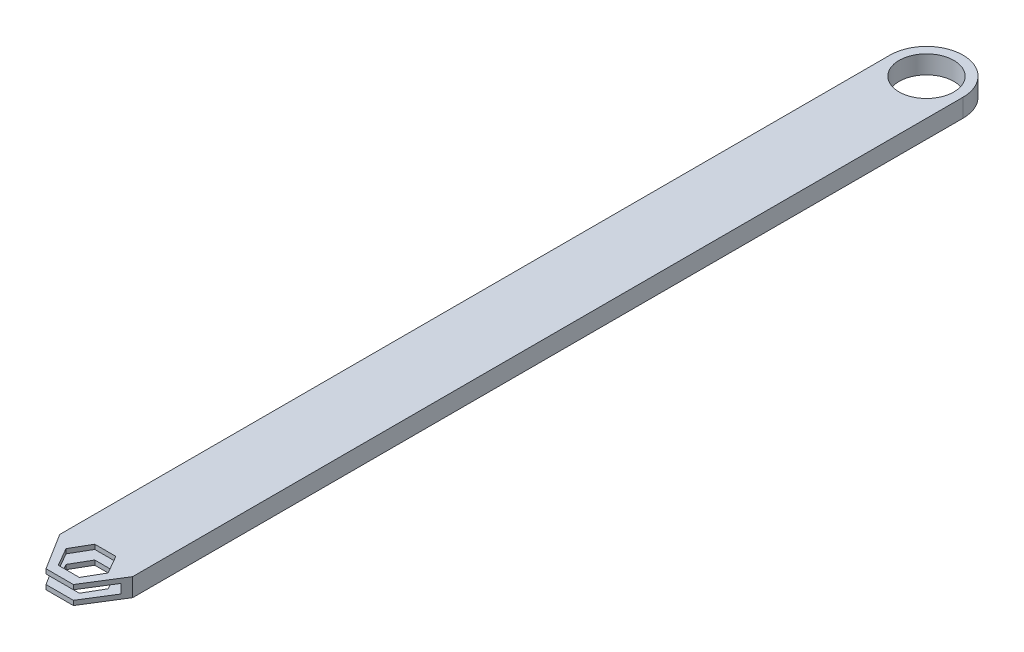
ISO-10303-21;
HEADER;
FILE_DESCRIPTION(('STEP AP214'),'2;1');
FILE_NAME('part.step','',(''),(''),'','','');
FILE_SCHEMA(('AUTOMOTIVE_DESIGN { 1 0 10303 214 1 1 1 1 }'));
ENDSEC;
DATA;
#1=APPLICATION_CONTEXT('core data for automotive mechanical design processes');
#2=APPLICATION_PROTOCOL_DEFINITION('international standard','automotive_design',2000,#1);
#3=PRODUCT_CONTEXT('',#1,'mechanical');
#4=PRODUCT('Part','Part','',(#3));
#5=PRODUCT_RELATED_PRODUCT_CATEGORY('part','',(#4));
#6=PRODUCT_DEFINITION_FORMATION('','',#4);
#7=PRODUCT_DEFINITION_CONTEXT('part definition',#1,'design');
#8=PRODUCT_DEFINITION('design','',#6,#7);
#9=PRODUCT_DEFINITION_SHAPE('','',#8);
#10=(LENGTH_UNIT() NAMED_UNIT(*) SI_UNIT(.MILLI.,.METRE.));
#11=(NAMED_UNIT(*) PLANE_ANGLE_UNIT() SI_UNIT($,.RADIAN.));
#12=(NAMED_UNIT(*) SI_UNIT($,.STERADIAN.) SOLID_ANGLE_UNIT());
#13=UNCERTAINTY_MEASURE_WITH_UNIT(LENGTH_MEASURE(1.E-05),#10,'distance_accuracy_value','');
#14=(GEOMETRIC_REPRESENTATION_CONTEXT(3) GLOBAL_UNCERTAINTY_ASSIGNED_CONTEXT((#13)) GLOBAL_UNIT_ASSIGNED_CONTEXT((#10,
#11,#12)) REPRESENTATION_CONTEXT('',''));
#15=CARTESIAN_POINT('',(0.,0.,0.));
#16=DIRECTION('',(0.,0.,1.));
#17=DIRECTION('',(1.,0.,0.));
#18=AXIS2_PLACEMENT_3D('',#15,#16,#17);
#19=CARTESIAN_POINT('',(0.,0.,304.8));
#20=DIRECTION('',(1.,0.,0.));
#21=DIRECTION('',(0.,0.,-1.));
#22=AXIS2_PLACEMENT_3D('',#19,#20,#21);
#23=PLANE('',#22);
#24=DIRECTION('',(0.,0.,-1.));
#25=VECTOR('',#24,1.);
#26=CARTESIAN_POINT('',(0.,0.,304.8));
#27=LINE('',#26,#25);
#28=CARTESIAN_POINT('',(0.,0.,288.925));
#29=VERTEX_POINT('',#28);
#30=CARTESIAN_POINT('',(0.,0.,0.));
#31=VERTEX_POINT('',#30);
#32=EDGE_CURVE('E213',#29,#31,#27,.T.);
#33=ORIENTED_EDGE('',*,*,#32,.F.);
#34=DIRECTION('',(0.,1.,0.));
#35=VECTOR('',#34,1.);
#36=CARTESIAN_POINT('',(0.,0.,288.925));
#37=LINE('',#36,#35);
#38=CARTESIAN_POINT('',(0.,6.35,288.925));
#39=VERTEX_POINT('',#38);
#40=EDGE_CURVE('E267',#29,#39,#37,.T.);
#41=ORIENTED_EDGE('',*,*,#40,.T.);
#42=DIRECTION('',(0.,0.,-1.));
#43=VECTOR('',#42,1.);
#44=CARTESIAN_POINT('',(0.,6.35,304.8));
#45=LINE('',#44,#43);
#46=CARTESIAN_POINT('',(0.,6.35,0.));
#47=VERTEX_POINT('',#46);
#48=EDGE_CURVE('E203',#39,#47,#45,.T.);
#49=ORIENTED_EDGE('',*,*,#48,.T.);
#50=DIRECTION('',(0.,-1.,0.));
#51=VECTOR('',#50,1.);
#52=CARTESIAN_POINT('',(0.,0.,0.));
#53=LINE('',#52,#51);
#54=EDGE_CURVE('E204',#47,#31,#53,.T.);
#55=ORIENTED_EDGE('',*,*,#54,.T.);
#56=EDGE_LOOP('',(#33,#41,#49,#55));
#57=FACE_BOUND('',#56,.T.);
#58=ADVANCED_FACE('F33',(#57),#23,.F.);
#59=CARTESIAN_POINT('',(0.,0.,304.8));
#60=DIRECTION('',(0.,1.,0.));
#61=DIRECTION('',(0.,0.,1.));
#62=AXIS2_PLACEMENT_3D('',#59,#60,#61);
#63=PLANE('',#62);
#64=CARTESIAN_POINT('',(12.7,0.,0.));
#65=DIRECTION('',(0.,1.,0.));
#66=DIRECTION('',(0.,0.,1.));
#67=AXIS2_PLACEMENT_3D('',#64,#65,#66);
#68=CIRCLE('',#67,9.525);
#69=CARTESIAN_POINT('',(12.7,0.,9.525));
#70=VERTEX_POINT('',#69);
#71=EDGE_CURVE('E382',#70,#70,#68,.T.);
#72=ORIENTED_EDGE('',*,*,#71,.T.);
#73=EDGE_LOOP('',(#72));
#74=FACE_BOUND('',#73,.T.);
#75=DIRECTION('',(-0.500000000000002,0.,0.866025403784438));
#76=VECTOR('',#75,1.);
#77=CARTESIAN_POINT('',(20.0323484187083,0.,292.1));
#78=LINE('',#77,#76);
#79=CARTESIAN_POINT('',(20.0323484187083,0.,292.1));
#80=VERTEX_POINT('',#79);
#81=CARTESIAN_POINT('',(16.3661742093542,0.,298.45));
#82=VERTEX_POINT('',#81);
#83=EDGE_CURVE('E312',#80,#82,#78,.T.);
#84=ORIENTED_EDGE('',*,*,#83,.F.);
#85=DIRECTION('',(0.499999999999998,0.,0.866025403784439));
#86=VECTOR('',#85,1.);
#87=CARTESIAN_POINT('',(16.3661742093543,0.,285.75));
#88=LINE('',#87,#86);
#89=CARTESIAN_POINT('',(16.3661742093543,0.,285.75));
#90=VERTEX_POINT('',#89);
#91=EDGE_CURVE('E290',#90,#80,#88,.T.);
#92=ORIENTED_EDGE('',*,*,#91,.F.);
#93=DIRECTION('',(1.,0.,0.));
#94=VECTOR('',#93,1.);
#95=CARTESIAN_POINT('',(9.03382579064585,0.,285.75));
#96=LINE('',#95,#94);
#97=CARTESIAN_POINT('',(9.03382579064585,0.,285.75));
#98=VERTEX_POINT('',#97);
#99=EDGE_CURVE('E295',#98,#90,#96,.T.);
#100=ORIENTED_EDGE('',*,*,#99,.F.);
#101=DIRECTION('',(0.499999999999999,0.,-0.866025403784439));
#102=VECTOR('',#101,1.);
#103=CARTESIAN_POINT('',(5.36765158129173,0.,292.1));
#104=LINE('',#103,#102);
#105=CARTESIAN_POINT('',(5.36765158129173,0.,292.1));
#106=VERTEX_POINT('',#105);
#107=EDGE_CURVE('E321',#106,#98,#104,.T.);
#108=ORIENTED_EDGE('',*,*,#107,.F.);
#109=DIRECTION('',(-0.500000000000001,0.,-0.866025403784438));
#110=VECTOR('',#109,1.);
#111=CARTESIAN_POINT('',(9.03382579064587,0.,298.45));
#112=LINE('',#111,#110);
#113=CARTESIAN_POINT('',(9.03382579064587,0.,298.45));
#114=VERTEX_POINT('',#113);
#115=EDGE_CURVE('E318',#114,#106,#112,.T.);
#116=ORIENTED_EDGE('',*,*,#115,.F.);
#117=DIRECTION('',(-1.,0.,0.));
#118=VECTOR('',#117,1.);
#119=CARTESIAN_POINT('',(16.3661742093542,0.,298.45));
#120=LINE('',#119,#118);
#121=EDGE_CURVE('E315',#82,#114,#120,.T.);
#122=ORIENTED_EDGE('',*,*,#121,.F.);
#123=EDGE_LOOP('',(#84,#92,#100,#108,#116,#122));
#124=FACE_BOUND('',#123,.T.);
#125=ORIENTED_EDGE('',*,*,#32,.T.);
#126=CARTESIAN_POINT('',(12.7,0.,0.));
#127=DIRECTION('',(0.,1.,0.));
#128=DIRECTION('',(0.,0.,1.));
#129=AXIS2_PLACEMENT_3D('',#126,#127,#128);
#130=CIRCLE('',#129,12.7);
#131=CARTESIAN_POINT('',(25.4,0.,0.));
#132=VERTEX_POINT('',#131);
#133=EDGE_CURVE('E196',#132,#31,#130,.T.);
#134=ORIENTED_EDGE('',*,*,#133,.F.);
#135=DIRECTION('',(0.,0.,-1.));
#136=VECTOR('',#135,1.);
#137=CARTESIAN_POINT('',(25.4,0.,304.8));
#138=LINE('',#137,#136);
#139=CARTESIAN_POINT('',(25.4,0.,288.925));
#140=VERTEX_POINT('',#139);
#141=EDGE_CURVE('E210',#140,#132,#138,.T.);
#142=ORIENTED_EDGE('',*,*,#141,.F.);
#143=DIRECTION('',(-0.529998940003178,0.,0.847998304005089));
#144=VECTOR('',#143,1.);
#145=CARTESIAN_POINT('',(17.4625,0.,301.625));
#146=LINE('',#145,#144);
#147=CARTESIAN_POINT('',(17.4625,0.,301.625));
#148=VERTEX_POINT('',#147);
#149=EDGE_CURVE('E396',#140,#148,#146,.T.);
#150=ORIENTED_EDGE('',*,*,#149,.T.);
#151=DIRECTION('',(-1.,0.,0.));
#152=VECTOR('',#151,1.);
#153=CARTESIAN_POINT('',(7.93750000000002,0.,301.625));
#154=LINE('',#153,#152);
#155=CARTESIAN_POINT('',(7.93750000000002,0.,301.625));
#156=VERTEX_POINT('',#155);
#157=EDGE_CURVE('E398',#148,#156,#154,.T.);
#158=ORIENTED_EDGE('',*,*,#157,.T.);
#159=DIRECTION('',(-0.52999894000318,0.,-0.847998304005088));
#160=VECTOR('',#159,1.);
#161=CARTESIAN_POINT('',(0.,0.,288.925));
#162=LINE('',#161,#160);
#163=EDGE_CURVE('E265',#156,#29,#162,.T.);
#164=ORIENTED_EDGE('',*,*,#163,.T.);
#165=EDGE_LOOP('',(#125,#134,#142,#150,#158,#164));
#166=FACE_BOUND('',#165,.T.);
#167=ADVANCED_FACE('F208',(#74,#124,#166),#63,.F.);
#168=CARTESIAN_POINT('',(25.4,0.,304.8));
#169=DIRECTION('',(-1.,0.,0.));
#170=DIRECTION('',(0.,0.,1.));
#171=AXIS2_PLACEMENT_3D('',#168,#169,#170);
#172=PLANE('',#171);
#173=DIRECTION('',(0.,0.,-1.));
#174=VECTOR('',#173,1.);
#175=CARTESIAN_POINT('',(25.4,6.35,304.8));
#176=LINE('',#175,#174);
#177=CARTESIAN_POINT('',(25.4,6.35,288.925));
#178=VERTEX_POINT('',#177);
#179=CARTESIAN_POINT('',(25.4,6.35,0.));
#180=VERTEX_POINT('',#179);
#181=EDGE_CURVE('E218',#178,#180,#176,.T.);
#182=ORIENTED_EDGE('',*,*,#181,.F.);
#183=DIRECTION('',(0.,1.,0.));
#184=VECTOR('',#183,1.);
#185=CARTESIAN_POINT('',(25.4,0.,288.925));
#186=LINE('',#185,#184);
#187=EDGE_CURVE('E54',#140,#178,#186,.T.);
#188=ORIENTED_EDGE('',*,*,#187,.F.);
#189=ORIENTED_EDGE('',*,*,#141,.T.);
#190=DIRECTION('',(0.,1.,0.));
#191=VECTOR('',#190,1.);
#192=CARTESIAN_POINT('',(25.4,0.,0.));
#193=LINE('',#192,#191);
#194=EDGE_CURVE('E192',#132,#180,#193,.T.);
#195=ORIENTED_EDGE('',*,*,#194,.T.);
#196=EDGE_LOOP('',(#182,#188,#189,#195));
#197=FACE_BOUND('',#196,.T.);
#198=ADVANCED_FACE('F217',(#197),#172,.F.);
#199=CARTESIAN_POINT('',(0.,6.35,304.8));
#200=DIRECTION('',(0.,-1.,0.));
#201=DIRECTION('',(0.,0.,-1.));
#202=AXIS2_PLACEMENT_3D('',#199,#200,#201);
#203=PLANE('',#202);
#204=CARTESIAN_POINT('',(12.7,6.35,0.));
#205=DIRECTION('',(0.,1.,0.));
#206=DIRECTION('',(0.,0.,1.));
#207=AXIS2_PLACEMENT_3D('',#204,#205,#206);
#208=CIRCLE('',#207,9.525);
#209=CARTESIAN_POINT('',(12.7,6.35,9.525));
#210=VERTEX_POINT('',#209);
#211=EDGE_CURVE('E385',#210,#210,#208,.T.);
#212=ORIENTED_EDGE('',*,*,#211,.F.);
#213=EDGE_LOOP('',(#212));
#214=FACE_BOUND('',#213,.T.);
#215=DIRECTION('',(1.,0.,0.));
#216=VECTOR('',#215,1.);
#217=CARTESIAN_POINT('',(9.03382579064585,6.35,285.75));
#218=LINE('',#217,#216);
#219=CARTESIAN_POINT('',(9.03382579064585,6.35,285.75));
#220=VERTEX_POINT('',#219);
#221=CARTESIAN_POINT('',(16.3661742093543,6.35,285.75));
#222=VERTEX_POINT('',#221);
#223=EDGE_CURVE('E307',#220,#222,#218,.T.);
#224=ORIENTED_EDGE('',*,*,#223,.T.);
#225=DIRECTION('',(0.499999999999998,0.,0.866025403784439));
#226=VECTOR('',#225,1.);
#227=CARTESIAN_POINT('',(16.3661742093543,6.35,285.75));
#228=LINE('',#227,#226);
#229=CARTESIAN_POINT('',(20.0323484187083,6.35,292.1));
#230=VERTEX_POINT('',#229);
#231=EDGE_CURVE('E291',#222,#230,#228,.T.);
#232=ORIENTED_EDGE('',*,*,#231,.T.);
#233=DIRECTION('',(-0.500000000000002,0.,0.866025403784438));
#234=VECTOR('',#233,1.);
#235=CARTESIAN_POINT('',(20.0323484187083,6.35,292.1));
#236=LINE('',#235,#234);
#237=CARTESIAN_POINT('',(16.3661742093542,6.35,298.45));
#238=VERTEX_POINT('',#237);
#239=EDGE_CURVE('E294',#230,#238,#236,.T.);
#240=ORIENTED_EDGE('',*,*,#239,.T.);
#241=DIRECTION('',(-1.,0.,0.));
#242=VECTOR('',#241,1.);
#243=CARTESIAN_POINT('',(16.3661742093542,6.35,298.45));
#244=LINE('',#243,#242);
#245=CARTESIAN_POINT('',(9.03382579064587,6.35,298.45));
#246=VERTEX_POINT('',#245);
#247=EDGE_CURVE('E298',#238,#246,#244,.T.);
#248=ORIENTED_EDGE('',*,*,#247,.T.);
#249=DIRECTION('',(-0.500000000000001,0.,-0.866025403784438));
#250=VECTOR('',#249,1.);
#251=CARTESIAN_POINT('',(9.03382579064587,6.35,298.45));
#252=LINE('',#251,#250);
#253=CARTESIAN_POINT('',(5.36765158129173,6.35,292.1));
#254=VERTEX_POINT('',#253);
#255=EDGE_CURVE('E301',#246,#254,#252,.T.);
#256=ORIENTED_EDGE('',*,*,#255,.T.);
#257=DIRECTION('',(0.499999999999999,0.,-0.866025403784439));
#258=VECTOR('',#257,1.);
#259=CARTESIAN_POINT('',(5.36765158129173,6.35,292.1));
#260=LINE('',#259,#258);
#261=EDGE_CURVE('E304',#254,#220,#260,.T.);
#262=ORIENTED_EDGE('',*,*,#261,.T.);
#263=EDGE_LOOP('',(#224,#232,#240,#248,#256,#262));
#264=FACE_BOUND('',#263,.T.);
#265=ORIENTED_EDGE('',*,*,#181,.T.);
#266=CARTESIAN_POINT('',(12.7,6.35,0.));
#267=DIRECTION('',(0.,1.,0.));
#268=DIRECTION('',(0.,0.,1.));
#269=AXIS2_PLACEMENT_3D('',#266,#267,#268);
#270=CIRCLE('',#269,12.7);
#271=EDGE_CURVE('E198',#180,#47,#270,.T.);
#272=ORIENTED_EDGE('',*,*,#271,.T.);
#273=ORIENTED_EDGE('',*,*,#48,.F.);
#274=DIRECTION('',(-0.52999894000318,0.,-0.847998304005088));
#275=VECTOR('',#274,1.);
#276=CARTESIAN_POINT('',(0.,6.35,288.925));
#277=LINE('',#276,#275);
#278=CARTESIAN_POINT('',(7.93750000000002,6.35,301.625));
#279=VERTEX_POINT('',#278);
#280=EDGE_CURVE('E381',#279,#39,#277,.T.);
#281=ORIENTED_EDGE('',*,*,#280,.F.);
#282=DIRECTION('',(-1.,0.,0.));
#283=VECTOR('',#282,1.);
#284=CARTESIAN_POINT('',(7.93750000000002,6.35,301.625));
#285=LINE('',#284,#283);
#286=CARTESIAN_POINT('',(17.4625,6.35,301.625));
#287=VERTEX_POINT('',#286);
#288=EDGE_CURVE('E402',#287,#279,#285,.T.);
#289=ORIENTED_EDGE('',*,*,#288,.F.);
#290=DIRECTION('',(-0.529998940003178,0.,0.847998304005089));
#291=VECTOR('',#290,1.);
#292=CARTESIAN_POINT('',(17.4625,6.35,301.625));
#293=LINE('',#292,#291);
#294=EDGE_CURVE('E395',#178,#287,#293,.T.);
#295=ORIENTED_EDGE('',*,*,#294,.F.);
#296=EDGE_LOOP('',(#265,#272,#273,#281,#289,#295));
#297=FACE_BOUND('',#296,.T.);
#298=ADVANCED_FACE('F379',(#214,#264,#297),#203,.F.);
#299=CARTESIAN_POINT('',(23.8125,4.7625,0.));
#300=DIRECTION('',(0.,1.,0.));
#301=DIRECTION('',(0.,0.,1.));
#302=AXIS2_PLACEMENT_3D('',#299,#300,#301);
#303=PLANE('',#302);
#304=DIRECTION('',(0.500000000000002,0.,-0.866025403784438));
#305=VECTOR('',#304,1.);
#306=CARTESIAN_POINT('',(147.460396536749,4.7625,71.3881463502232));
#307=LINE('',#306,#305);
#308=CARTESIAN_POINT('',(16.3661742093542,4.7625,298.45));
#309=VERTEX_POINT('',#308);
#310=CARTESIAN_POINT('',(20.0323484187083,4.7625,292.1));
#311=VERTEX_POINT('',#310);
#312=EDGE_CURVE('E329',#309,#311,#307,.T.);
#313=ORIENTED_EDGE('',*,*,#312,.T.);
#314=DIRECTION('',(-0.499999999999998,0.,-0.86602540378444));
#315=VECTOR('',#314,1.);
#316=CARTESIAN_POINT('',(-105.505623908686,4.7625,74.6618536497767));
#317=LINE('',#316,#315);
#318=CARTESIAN_POINT('',(16.3661742093543,4.7625,285.75));
#319=VERTEX_POINT('',#318);
#320=EDGE_CURVE('E363',#311,#319,#317,.T.);
#321=ORIENTED_EDGE('',*,*,#320,.T.);
#322=DIRECTION('',(-1.,0.,0.));
#323=VECTOR('',#322,1.);
#324=CARTESIAN_POINT('',(23.8125,4.7625,285.75));
#325=LINE('',#324,#323);
#326=CARTESIAN_POINT('',(9.03382579064585,4.7625,285.75));
#327=VERTEX_POINT('',#326);
#328=EDGE_CURVE('E360',#319,#327,#325,.T.);
#329=ORIENTED_EDGE('',*,*,#328,.T.);
#330=DIRECTION('',(-0.499999999999999,0.,0.866025403784439));
#331=VECTOR('',#330,1.);
#332=CARTESIAN_POINT('',(136.461873908686,4.7625,65.0381463502224));
#333=LINE('',#332,#331);
#334=CARTESIAN_POINT('',(5.36765158129173,4.7625,292.1));
#335=VERTEX_POINT('',#334);
#336=EDGE_CURVE('E357',#327,#335,#333,.T.);
#337=ORIENTED_EDGE('',*,*,#336,.T.);
#338=DIRECTION('',(0.500000000000001,0.,0.866025403784438));
#339=VECTOR('',#338,1.);
#340=CARTESIAN_POINT('',(-116.504146536749,4.7625,81.0118536497775));
#341=LINE('',#340,#339);
#342=CARTESIAN_POINT('',(9.03382579064587,4.7625,298.45));
#343=VERTEX_POINT('',#342);
#344=EDGE_CURVE('E354',#335,#343,#341,.T.);
#345=ORIENTED_EDGE('',*,*,#344,.T.);
#346=DIRECTION('',(1.,0.,0.));
#347=VECTOR('',#346,1.);
#348=CARTESIAN_POINT('',(23.8125,4.7625,298.45));
#349=LINE('',#348,#347);
#350=EDGE_CURVE('E351',#343,#309,#349,.T.);
#351=ORIENTED_EDGE('',*,*,#350,.T.);
#352=EDGE_LOOP('',(#313,#321,#329,#337,#345,#351));
#353=FACE_BOUND('',#352,.T.);
#354=DIRECTION('',(0.,0.,1.));
#355=VECTOR('',#354,1.);
#356=CARTESIAN_POINT('',(1.5875,4.7625,0.));
#357=LINE('',#356,#355);
#358=CARTESIAN_POINT('',(1.5875,4.7625,6.14836106210428));
#359=VERTEX_POINT('',#358);
#360=CARTESIAN_POINT('',(1.5875,4.7625,291.465));
#361=VERTEX_POINT('',#360);
#362=EDGE_CURVE('E366',#359,#361,#357,.T.);
#363=ORIENTED_EDGE('',*,*,#362,.F.);
#364=CARTESIAN_POINT('',(12.7,4.7625,0.));
#365=DIRECTION('',(0.,1.,0.));
#366=DIRECTION('',(0.,0.,1.));
#367=AXIS2_PLACEMENT_3D('',#364,#365,#366);
#368=CIRCLE('',#367,12.7);
#369=CARTESIAN_POINT('',(23.8125,4.7625,6.14836106210428));
#370=VERTEX_POINT('',#369);
#371=EDGE_CURVE('E47',#359,#370,#368,.T.);
#372=ORIENTED_EDGE('',*,*,#371,.T.);
#373=DIRECTION('',(0.,0.,1.));
#374=VECTOR('',#373,1.);
#375=CARTESIAN_POINT('',(23.8125,4.7625,0.));
#376=LINE('',#375,#374);
#377=CARTESIAN_POINT('',(23.8125,4.7625,291.465));
#378=VERTEX_POINT('',#377);
#379=EDGE_CURVE('E367',#370,#378,#376,.T.);
#380=ORIENTED_EDGE('',*,*,#379,.T.);
#381=DIRECTION('',(-0.529998940003178,0.,0.84799830400509));
#382=VECTOR('',#381,1.);
#383=CARTESIAN_POINT('',(154.808005617977,4.7625,81.8721910112352));
#384=LINE('',#383,#382);
#385=CARTESIAN_POINT('',(17.4625,4.7625,301.625));
#386=VERTEX_POINT('',#385);
#387=EDGE_CURVE('E284',#378,#386,#384,.T.);
#388=ORIENTED_EDGE('',*,*,#387,.T.);
#389=DIRECTION('',(-1.,0.,0.));
#390=VECTOR('',#389,1.);
#391=CARTESIAN_POINT('',(23.8125,4.7625,301.625));
#392=LINE('',#391,#390);
#393=CARTESIAN_POINT('',(7.93750000000002,4.7625,301.625));
#394=VERTEX_POINT('',#393);
#395=EDGE_CURVE('E287',#386,#394,#392,.T.);
#396=ORIENTED_EDGE('',*,*,#395,.T.);
#397=DIRECTION('',(-0.52999894000318,0.,-0.847998304005088));
#398=VECTOR('',#397,1.);
#399=CARTESIAN_POINT('',(-123.165028089888,4.7625,91.8609550561796));
#400=LINE('',#399,#398);
#401=EDGE_CURVE('E278',#394,#361,#400,.T.);
#402=ORIENTED_EDGE('',*,*,#401,.T.);
#403=EDGE_LOOP('',(#363,#372,#380,#388,#396,#402));
#404=FACE_BOUND('',#403,.T.);
#405=ADVANCED_FACE('F413',(#353,#404),#303,.F.);
#406=CARTESIAN_POINT('',(23.8125,1.5875,0.));
#407=DIRECTION('',(1.,0.,0.));
#408=DIRECTION('',(0.,0.,-1.));
#409=AXIS2_PLACEMENT_3D('',#406,#407,#408);
#410=PLANE('',#409);
#411=ORIENTED_EDGE('',*,*,#379,.F.);
#412=DIRECTION('',(0.,1.,0.));
#413=VECTOR('',#412,1.);
#414=CARTESIAN_POINT('',(23.8125,0.,6.14836106210428));
#415=LINE('',#414,#413);
#416=CARTESIAN_POINT('',(23.8125,1.5875,6.14836106210428));
#417=VERTEX_POINT('',#416);
#418=EDGE_CURVE('E391',#370,#417,#415,.F.);
#419=ORIENTED_EDGE('',*,*,#418,.T.);
#420=DIRECTION('',(0.,0.,1.));
#421=VECTOR('',#420,1.);
#422=CARTESIAN_POINT('',(23.8125,1.5875,0.));
#423=LINE('',#422,#421);
#424=CARTESIAN_POINT('',(23.8125,1.5875,291.465));
#425=VERTEX_POINT('',#424);
#426=EDGE_CURVE('E369',#417,#425,#423,.T.);
#427=ORIENTED_EDGE('',*,*,#426,.T.);
#428=DIRECTION('',(0.,1.,0.));
#429=VECTOR('',#428,1.);
#430=CARTESIAN_POINT('',(23.8125,1.5875,291.465));
#431=LINE('',#430,#429);
#432=EDGE_CURVE('E281',#425,#378,#431,.T.);
#433=ORIENTED_EDGE('',*,*,#432,.T.);
#434=EDGE_LOOP('',(#411,#419,#427,#433));
#435=FACE_BOUND('',#434,.T.);
#436=ADVANCED_FACE('F416',(#435),#410,.F.);
#437=CARTESIAN_POINT('',(1.5875,1.5875,0.));
#438=DIRECTION('',(0.,-1.,0.));
#439=DIRECTION('',(0.,0.,-1.));
#440=AXIS2_PLACEMENT_3D('',#437,#438,#439);
#441=PLANE('',#440);
#442=DIRECTION('',(1.,0.,0.));
#443=VECTOR('',#442,1.);
#444=CARTESIAN_POINT('',(1.5875,1.5875,285.75));
#445=LINE('',#444,#443);
#446=CARTESIAN_POINT('',(9.03382579064585,1.5875,285.75));
#447=VERTEX_POINT('',#446);
#448=CARTESIAN_POINT('',(16.3661742093543,1.5875,285.75));
#449=VERTEX_POINT('',#448);
#450=EDGE_CURVE('E236',#447,#449,#445,.T.);
#451=ORIENTED_EDGE('',*,*,#450,.T.);
#452=DIRECTION('',(0.499999999999998,0.,0.86602540378444));
#453=VECTOR('',#452,1.);
#454=CARTESIAN_POINT('',(-111.061873908686,1.5875,65.0381463502222));
#455=LINE('',#454,#453);
#456=CARTESIAN_POINT('',(20.0323484187083,1.5875,292.1));
#457=VERTEX_POINT('',#456);
#458=EDGE_CURVE('E239',#449,#457,#455,.T.);
#459=ORIENTED_EDGE('',*,*,#458,.T.);
#460=DIRECTION('',(-0.500000000000002,0.,0.866025403784438));
#461=VECTOR('',#460,1.);
#462=CARTESIAN_POINT('',(141.904146536749,1.5875,81.0118536497778));
#463=LINE('',#462,#461);
#464=CARTESIAN_POINT('',(16.3661742093542,1.5875,298.45));
#465=VERTEX_POINT('',#464);
#466=EDGE_CURVE('E220',#457,#465,#463,.T.);
#467=ORIENTED_EDGE('',*,*,#466,.T.);
#468=DIRECTION('',(-1.,0.,0.));
#469=VECTOR('',#468,1.);
#470=CARTESIAN_POINT('',(1.5875,1.5875,298.45));
#471=LINE('',#470,#469);
#472=CARTESIAN_POINT('',(9.03382579064587,1.5875,298.45));
#473=VERTEX_POINT('',#472);
#474=EDGE_CURVE('E227',#465,#473,#471,.T.);
#475=ORIENTED_EDGE('',*,*,#474,.T.);
#476=DIRECTION('',(-0.500000000000001,0.,-0.866025403784438));
#477=VECTOR('',#476,1.);
#478=CARTESIAN_POINT('',(-122.060396536749,1.5875,71.3881463502229));
#479=LINE('',#478,#477);
#480=CARTESIAN_POINT('',(5.36765158129173,1.5875,292.1));
#481=VERTEX_POINT('',#480);
#482=EDGE_CURVE('E230',#473,#481,#479,.T.);
#483=ORIENTED_EDGE('',*,*,#482,.T.);
#484=DIRECTION('',(0.499999999999999,0.,-0.866025403784439));
#485=VECTOR('',#484,1.);
#486=CARTESIAN_POINT('',(130.905623908686,1.5875,74.661853649777));
#487=LINE('',#486,#485);
#488=EDGE_CURVE('E233',#481,#447,#487,.T.);
#489=ORIENTED_EDGE('',*,*,#488,.T.);
#490=EDGE_LOOP('',(#451,#459,#467,#475,#483,#489));
#491=FACE_BOUND('',#490,.T.);
#492=ORIENTED_EDGE('',*,*,#426,.F.);
#493=CARTESIAN_POINT('',(12.7,1.5875,0.));
#494=DIRECTION('',(0.,-1.,0.));
#495=DIRECTION('',(0.,0.,-1.));
#496=AXIS2_PLACEMENT_3D('',#493,#494,#495);
#497=CIRCLE('',#496,12.7);
#498=CARTESIAN_POINT('',(1.5875,1.5875,6.14836106210428));
#499=VERTEX_POINT('',#498);
#500=EDGE_CURVE('E215',#417,#499,#497,.T.);
#501=ORIENTED_EDGE('',*,*,#500,.T.);
#502=DIRECTION('',(0.,0.,1.));
#503=VECTOR('',#502,1.);
#504=CARTESIAN_POINT('',(1.5875,1.5875,0.));
#505=LINE('',#504,#503);
#506=CARTESIAN_POINT('',(1.5875,1.5875,291.465));
#507=VERTEX_POINT('',#506);
#508=EDGE_CURVE('E371',#499,#507,#505,.T.);
#509=ORIENTED_EDGE('',*,*,#508,.T.);
#510=DIRECTION('',(0.52999894000318,0.,0.847998304005088));
#511=VECTOR('',#510,1.);
#512=CARTESIAN_POINT('',(-129.408005617977,1.5875,81.8721910112358));
#513=LINE('',#512,#511);
#514=CARTESIAN_POINT('',(7.93750000000002,1.5875,301.625));
#515=VERTEX_POINT('',#514);
#516=EDGE_CURVE('E253',#507,#515,#513,.T.);
#517=ORIENTED_EDGE('',*,*,#516,.T.);
#518=DIRECTION('',(1.,0.,0.));
#519=VECTOR('',#518,1.);
#520=CARTESIAN_POINT('',(1.5875,1.5875,301.625));
#521=LINE('',#520,#519);
#522=CARTESIAN_POINT('',(17.4625,1.5875,301.625));
#523=VERTEX_POINT('',#522);
#524=EDGE_CURVE('E40',#515,#523,#521,.T.);
#525=ORIENTED_EDGE('',*,*,#524,.T.);
#526=DIRECTION('',(0.529998940003178,0.,-0.84799830400509));
#527=VECTOR('',#526,1.);
#528=CARTESIAN_POINT('',(148.565028089887,1.5875,91.860955056179));
#529=LINE('',#528,#527);
#530=EDGE_CURVE('E245',#523,#425,#529,.T.);
#531=ORIENTED_EDGE('',*,*,#530,.T.);
#532=EDGE_LOOP('',(#492,#501,#509,#517,#525,#531));
#533=FACE_BOUND('',#532,.T.);
#534=ADVANCED_FACE('F251',(#491,#533),#441,.F.);
#535=CARTESIAN_POINT('',(1.5875,4.7625,0.));
#536=DIRECTION('',(-1.,0.,0.));
#537=DIRECTION('',(0.,0.,1.));
#538=AXIS2_PLACEMENT_3D('',#535,#536,#537);
#539=PLANE('',#538);
#540=ORIENTED_EDGE('',*,*,#508,.F.);
#541=DIRECTION('',(0.,1.,0.));
#542=VECTOR('',#541,1.);
#543=CARTESIAN_POINT('',(1.5875,0.,6.14836106210428));
#544=LINE('',#543,#542);
#545=EDGE_CURVE('E11',#499,#359,#544,.T.);
#546=ORIENTED_EDGE('',*,*,#545,.T.);
#547=ORIENTED_EDGE('',*,*,#362,.T.);
#548=DIRECTION('',(0.,-1.,0.));
#549=VECTOR('',#548,1.);
#550=CARTESIAN_POINT('',(1.5875,4.7625,291.465));
#551=LINE('',#550,#549);
#552=EDGE_CURVE('E242',#361,#507,#551,.T.);
#553=ORIENTED_EDGE('',*,*,#552,.T.);
#554=EDGE_LOOP('',(#540,#546,#547,#553));
#555=FACE_BOUND('',#554,.T.);
#556=ADVANCED_FACE('F419',(#555),#539,.F.);
#557=CARTESIAN_POINT('',(20.0323484187083,6.35,292.1));
#558=DIRECTION('',(0.866025403784438,0.,0.500000000000002));
#559=DIRECTION('',(0.500000000000002,0.,-0.866025403784438));
#560=AXIS2_PLACEMENT_3D('',#557,#558,#559);
#561=PLANE('',#560);
#562=DIRECTION('',(0.,-1.,0.));
#563=VECTOR('',#562,1.);
#564=CARTESIAN_POINT('',(20.0323484187083,6.35,292.1));
#565=LINE('',#564,#563);
#566=EDGE_CURVE('E310',#457,#80,#565,.T.);
#567=ORIENTED_EDGE('',*,*,#566,.T.);
#568=ORIENTED_EDGE('',*,*,#83,.T.);
#569=DIRECTION('',(0.,-1.,0.));
#570=VECTOR('',#569,1.);
#571=CARTESIAN_POINT('',(16.3661742093542,6.35,298.45));
#572=LINE('',#571,#570);
#573=EDGE_CURVE('E346',#465,#82,#572,.T.);
#574=ORIENTED_EDGE('',*,*,#573,.F.);
#575=ORIENTED_EDGE('',*,*,#466,.F.);
#576=EDGE_LOOP('',(#567,#568,#574,#575));
#577=FACE_BOUND('',#576,.T.);
#578=ADVANCED_FACE('F449',(#577),#561,.F.);
#579=CARTESIAN_POINT('',(16.3661742093542,6.35,298.45));
#580=DIRECTION('',(0.,0.,1.));
#581=DIRECTION('',(1.,0.,0.));
#582=AXIS2_PLACEMENT_3D('',#579,#580,#581);
#583=PLANE('',#582);
#584=ORIENTED_EDGE('',*,*,#573,.T.);
#585=ORIENTED_EDGE('',*,*,#121,.T.);
#586=DIRECTION('',(0.,-1.,0.));
#587=VECTOR('',#586,1.);
#588=CARTESIAN_POINT('',(9.03382579064587,6.35,298.45));
#589=LINE('',#588,#587);
#590=EDGE_CURVE('E342',#473,#114,#589,.T.);
#591=ORIENTED_EDGE('',*,*,#590,.F.);
#592=ORIENTED_EDGE('',*,*,#474,.F.);
#593=EDGE_LOOP('',(#584,#585,#591,#592));
#594=FACE_BOUND('',#593,.T.);
#595=ADVANCED_FACE('F470',(#594),#583,.F.);
#596=CARTESIAN_POINT('',(9.03382579064587,6.35,298.45));
#597=DIRECTION('',(-0.866025403784438,0.,0.500000000000001));
#598=DIRECTION('',(0.500000000000001,0.,0.866025403784438));
#599=AXIS2_PLACEMENT_3D('',#596,#597,#598);
#600=PLANE('',#599);
#601=ORIENTED_EDGE('',*,*,#590,.T.);
#602=ORIENTED_EDGE('',*,*,#115,.T.);
#603=DIRECTION('',(0.,-1.,0.));
#604=VECTOR('',#603,1.);
#605=CARTESIAN_POINT('',(5.36765158129173,6.35,292.1));
#606=LINE('',#605,#604);
#607=EDGE_CURVE('E338',#481,#106,#606,.T.);
#608=ORIENTED_EDGE('',*,*,#607,.F.);
#609=ORIENTED_EDGE('',*,*,#482,.F.);
#610=EDGE_LOOP('',(#601,#602,#608,#609));
#611=FACE_BOUND('',#610,.T.);
#612=ADVANCED_FACE('F475',(#611),#600,.F.);
#613=CARTESIAN_POINT('',(5.36765158129173,6.35,292.1));
#614=DIRECTION('',(-0.866025403784439,0.,-0.499999999999999));
#615=DIRECTION('',(-0.499999999999999,0.,0.866025403784439));
#616=AXIS2_PLACEMENT_3D('',#613,#614,#615);
#617=PLANE('',#616);
#618=ORIENTED_EDGE('',*,*,#607,.T.);
#619=ORIENTED_EDGE('',*,*,#107,.T.);
#620=DIRECTION('',(0.,-1.,0.));
#621=VECTOR('',#620,1.);
#622=CARTESIAN_POINT('',(9.03382579064585,6.35,285.75));
#623=LINE('',#622,#621);
#624=EDGE_CURVE('E334',#447,#98,#623,.T.);
#625=ORIENTED_EDGE('',*,*,#624,.F.);
#626=ORIENTED_EDGE('',*,*,#488,.F.);
#627=EDGE_LOOP('',(#618,#619,#625,#626));
#628=FACE_BOUND('',#627,.T.);
#629=ADVANCED_FACE('F479',(#628),#617,.F.);
#630=CARTESIAN_POINT('',(9.03382579064585,6.35,285.75));
#631=DIRECTION('',(0.,0.,-1.));
#632=DIRECTION('',(-1.,0.,0.));
#633=AXIS2_PLACEMENT_3D('',#630,#631,#632);
#634=PLANE('',#633);
#635=ORIENTED_EDGE('',*,*,#624,.T.);
#636=ORIENTED_EDGE('',*,*,#99,.T.);
#637=DIRECTION('',(0.,-1.,0.));
#638=VECTOR('',#637,1.);
#639=CARTESIAN_POINT('',(16.3661742093543,6.35,285.75));
#640=LINE('',#639,#638);
#641=EDGE_CURVE('E330',#449,#90,#640,.T.);
#642=ORIENTED_EDGE('',*,*,#641,.F.);
#643=ORIENTED_EDGE('',*,*,#450,.F.);
#644=EDGE_LOOP('',(#635,#636,#642,#643));
#645=FACE_BOUND('',#644,.T.);
#646=ADVANCED_FACE('F483',(#645),#634,.F.);
#647=CARTESIAN_POINT('',(16.3661742093543,6.35,285.75));
#648=DIRECTION('',(0.86602540378444,0.,-0.499999999999998));
#649=DIRECTION('',(-0.499999999999998,0.,-0.86602540378444));
#650=AXIS2_PLACEMENT_3D('',#647,#648,#649);
#651=PLANE('',#650);
#652=ORIENTED_EDGE('',*,*,#641,.T.);
#653=ORIENTED_EDGE('',*,*,#91,.T.);
#654=ORIENTED_EDGE('',*,*,#566,.F.);
#655=ORIENTED_EDGE('',*,*,#458,.F.);
#656=EDGE_LOOP('',(#652,#653,#654,#655));
#657=FACE_BOUND('',#656,.T.);
#658=ADVANCED_FACE('F459',(#657),#651,.F.);
#659=EDGE_CURVE('E347',#230,#311,#565,.T.);
#660=ORIENTED_EDGE('',*,*,#659,.F.);
#661=ORIENTED_EDGE('',*,*,#231,.F.);
#662=EDGE_CURVE('E326',#222,#319,#640,.T.);
#663=ORIENTED_EDGE('',*,*,#662,.T.);
#664=ORIENTED_EDGE('',*,*,#320,.F.);
#665=EDGE_LOOP('',(#660,#661,#663,#664));
#666=FACE_BOUND('',#665,.T.);
#667=ADVANCED_FACE('F455',(#666),#651,.F.);
#668=ORIENTED_EDGE('',*,*,#662,.F.);
#669=ORIENTED_EDGE('',*,*,#223,.F.);
#670=EDGE_CURVE('E331',#220,#327,#623,.T.);
#671=ORIENTED_EDGE('',*,*,#670,.T.);
#672=ORIENTED_EDGE('',*,*,#328,.F.);
#673=EDGE_LOOP('',(#668,#669,#671,#672));
#674=FACE_BOUND('',#673,.T.);
#675=ADVANCED_FACE('F458',(#674),#634,.F.);
#676=ORIENTED_EDGE('',*,*,#670,.F.);
#677=ORIENTED_EDGE('',*,*,#261,.F.);
#678=EDGE_CURVE('E335',#254,#335,#606,.T.);
#679=ORIENTED_EDGE('',*,*,#678,.T.);
#680=ORIENTED_EDGE('',*,*,#336,.F.);
#681=EDGE_LOOP('',(#676,#677,#679,#680));
#682=FACE_BOUND('',#681,.T.);
#683=ADVANCED_FACE('F473',(#682),#617,.F.);
#684=ORIENTED_EDGE('',*,*,#678,.F.);
#685=ORIENTED_EDGE('',*,*,#255,.F.);
#686=EDGE_CURVE('E339',#246,#343,#589,.T.);
#687=ORIENTED_EDGE('',*,*,#686,.T.);
#688=ORIENTED_EDGE('',*,*,#344,.F.);
#689=EDGE_LOOP('',(#684,#685,#687,#688));
#690=FACE_BOUND('',#689,.T.);
#691=ADVANCED_FACE('F468',(#690),#600,.F.);
#692=ORIENTED_EDGE('',*,*,#686,.F.);
#693=ORIENTED_EDGE('',*,*,#247,.F.);
#694=EDGE_CURVE('E343',#238,#309,#572,.T.);
#695=ORIENTED_EDGE('',*,*,#694,.T.);
#696=ORIENTED_EDGE('',*,*,#350,.F.);
#697=EDGE_LOOP('',(#692,#693,#695,#696));
#698=FACE_BOUND('',#697,.T.);
#699=ADVANCED_FACE('F464',(#698),#583,.F.);
#700=ORIENTED_EDGE('',*,*,#694,.F.);
#701=ORIENTED_EDGE('',*,*,#239,.F.);
#702=ORIENTED_EDGE('',*,*,#659,.T.);
#703=ORIENTED_EDGE('',*,*,#312,.F.);
#704=EDGE_LOOP('',(#700,#701,#702,#703));
#705=FACE_BOUND('',#704,.T.);
#706=ADVANCED_FACE('F461',(#705),#561,.F.);
#707=CARTESIAN_POINT('',(7.93750000000002,0.,301.625));
#708=DIRECTION('',(0.,0.,-1.));
#709=DIRECTION('',(-1.,0.,0.));
#710=AXIS2_PLACEMENT_3D('',#707,#708,#709);
#711=PLANE('',#710);
#712=DIRECTION('',(0.,1.,0.));
#713=VECTOR('',#712,1.);
#714=CARTESIAN_POINT('',(17.4625,0.,301.625));
#715=LINE('',#714,#713);
#716=EDGE_CURVE('E275',#386,#287,#715,.T.);
#717=ORIENTED_EDGE('',*,*,#716,.T.);
#718=ORIENTED_EDGE('',*,*,#288,.T.);
#719=DIRECTION('',(0.,1.,0.));
#720=VECTOR('',#719,1.);
#721=CARTESIAN_POINT('',(7.93750000000002,0.,301.625));
#722=LINE('',#721,#720);
#723=EDGE_CURVE('E268',#394,#279,#722,.T.);
#724=ORIENTED_EDGE('',*,*,#723,.F.);
#725=ORIENTED_EDGE('',*,*,#395,.F.);
#726=EDGE_LOOP('',(#717,#718,#724,#725));
#727=FACE_BOUND('',#726,.T.);
#728=ADVANCED_FACE('F406',(#727),#711,.F.);
#729=EDGE_CURVE('E259',#156,#515,#722,.T.);
#730=ORIENTED_EDGE('',*,*,#729,.F.);
#731=ORIENTED_EDGE('',*,*,#157,.F.);
#732=EDGE_CURVE('E261',#148,#523,#715,.T.);
#733=ORIENTED_EDGE('',*,*,#732,.T.);
#734=ORIENTED_EDGE('',*,*,#524,.F.);
#735=EDGE_LOOP('',(#730,#731,#733,#734));
#736=FACE_BOUND('',#735,.T.);
#737=ADVANCED_FACE('F257',(#736),#711,.F.);
#738=CARTESIAN_POINT('',(17.4625,0.,301.625));
#739=DIRECTION('',(-0.847998304005089,0.,-0.529998940003178));
#740=DIRECTION('',(-0.529998940003178,0.,0.84799830400509));
#741=AXIS2_PLACEMENT_3D('',#738,#739,#740);
#742=PLANE('',#741);
#743=ORIENTED_EDGE('',*,*,#432,.F.);
#744=ORIENTED_EDGE('',*,*,#530,.F.);
#745=ORIENTED_EDGE('',*,*,#732,.F.);
#746=ORIENTED_EDGE('',*,*,#149,.F.);
#747=ORIENTED_EDGE('',*,*,#187,.T.);
#748=ORIENTED_EDGE('',*,*,#294,.T.);
#749=ORIENTED_EDGE('',*,*,#716,.F.);
#750=ORIENTED_EDGE('',*,*,#387,.F.);
#751=EDGE_LOOP('',(#743,#744,#745,#746,#747,#748,#749,#750));
#752=FACE_BOUND('',#751,.T.);
#753=ADVANCED_FACE('F409',(#752),#742,.F.);
#754=CARTESIAN_POINT('',(0.,0.,288.925));
#755=DIRECTION('',(0.847998304005088,0.,-0.52999894000318));
#756=DIRECTION('',(-0.52999894000318,0.,-0.847998304005088));
#757=AXIS2_PLACEMENT_3D('',#754,#755,#756);
#758=PLANE('',#757);
#759=ORIENTED_EDGE('',*,*,#723,.T.);
#760=ORIENTED_EDGE('',*,*,#280,.T.);
#761=ORIENTED_EDGE('',*,*,#40,.F.);
#762=ORIENTED_EDGE('',*,*,#163,.F.);
#763=ORIENTED_EDGE('',*,*,#729,.T.);
#764=ORIENTED_EDGE('',*,*,#516,.F.);
#765=ORIENTED_EDGE('',*,*,#552,.F.);
#766=ORIENTED_EDGE('',*,*,#401,.F.);
#767=EDGE_LOOP('',(#759,#760,#761,#762,#763,#764,#765,#766));
#768=FACE_BOUND('',#767,.T.);
#769=ADVANCED_FACE('F263',(#768),#758,.F.);
#770=CARTESIAN_POINT('',(12.7,0.,0.));
#771=DIRECTION('',(0.,1.,0.));
#772=DIRECTION('',(0.,0.,1.));
#773=AXIS2_PLACEMENT_3D('',#770,#771,#772);
#774=CYLINDRICAL_SURFACE('',#773,12.7);
#775=ORIENTED_EDGE('',*,*,#371,.F.);
#776=ORIENTED_EDGE('',*,*,#545,.F.);
#777=ORIENTED_EDGE('',*,*,#500,.F.);
#778=ORIENTED_EDGE('',*,*,#418,.F.);
#779=EDGE_LOOP('',(#775,#776,#777,#778));
#780=FACE_BOUND('',#779,.T.);
#781=ADVANCED_FACE('F420',(#780),#774,.T.);
#782=ORIENTED_EDGE('',*,*,#133,.T.);
#783=ORIENTED_EDGE('',*,*,#54,.F.);
#784=ORIENTED_EDGE('',*,*,#271,.F.);
#785=ORIENTED_EDGE('',*,*,#194,.F.);
#786=EDGE_LOOP('',(#782,#783,#784,#785));
#787=FACE_BOUND('',#786,.T.);
#788=ADVANCED_FACE('F194',(#787),#774,.T.);
#789=CARTESIAN_POINT('',(12.7,0.,0.));
#790=DIRECTION('',(0.,1.,0.));
#791=DIRECTION('',(0.,0.,1.));
#792=AXIS2_PLACEMENT_3D('',#789,#790,#791);
#793=CYLINDRICAL_SURFACE('',#792,9.525);
#794=ORIENTED_EDGE('',*,*,#71,.F.);
#795=EDGE_LOOP('',(#794));
#796=FACE_BOUND('',#795,.T.);
#797=ORIENTED_EDGE('',*,*,#211,.T.);
#798=EDGE_LOOP('',(#797));
#799=FACE_BOUND('',#798,.T.);
#800=ADVANCED_FACE('F427',(#796,#799),#793,.F.);
#801=CLOSED_SHELL('',(#58,#167,#198,#298,#405,#436,#534,#556,#578,#595,#612,#629,#646,#658,#667,
#675,#683,#691,#699,#706,#728,#737,#753,#769,#781,#788,#800));
#802=MANIFOLD_SOLID_BREP('B2',#801);
#803=ADVANCED_BREP_SHAPE_REPRESENTATION('',(#18,#802),#14);
#804=SHAPE_DEFINITION_REPRESENTATION(#9,#803);
ENDSEC;
END-ISO-10303-21;
